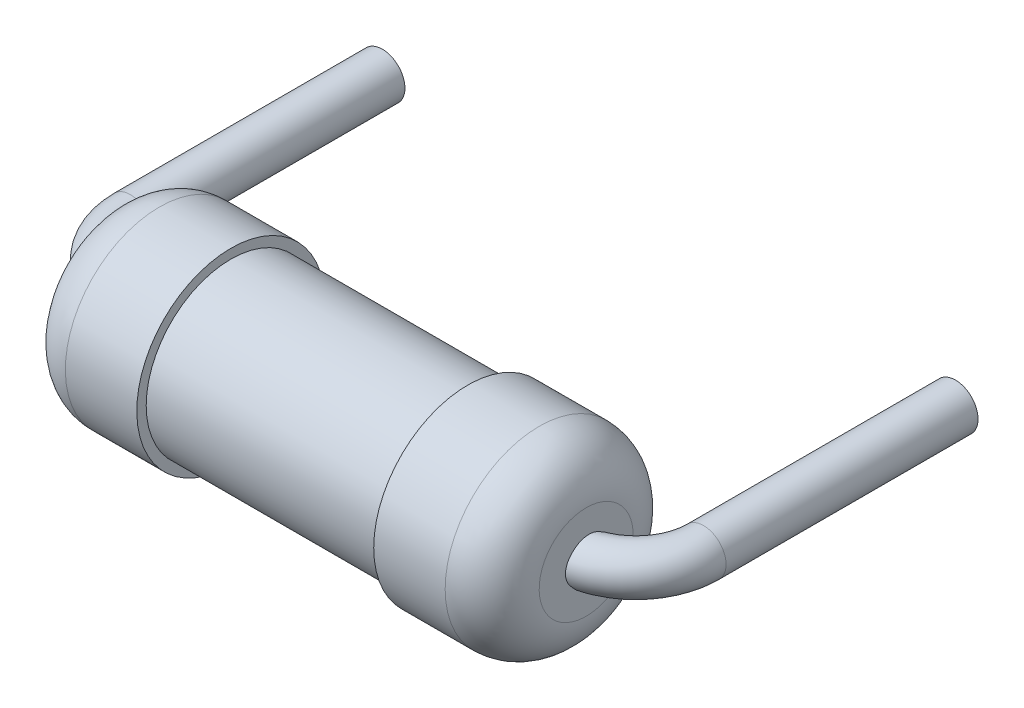
ISO-10303-21;
HEADER;
FILE_DESCRIPTION(('STEP AP214'),'2;1');
FILE_NAME('part.step','',(''),(''),'','','');
FILE_SCHEMA(('AUTOMOTIVE_DESIGN { 1 0 10303 214 1 1 1 1 }'));
ENDSEC;
DATA;
#1=APPLICATION_CONTEXT('core data for automotive mechanical design processes');
#2=APPLICATION_PROTOCOL_DEFINITION('international standard','automotive_design',2000,#1);
#3=PRODUCT_CONTEXT('',#1,'mechanical');
#4=PRODUCT('Part','Part','',(#3));
#5=PRODUCT_RELATED_PRODUCT_CATEGORY('part','',(#4));
#6=PRODUCT_DEFINITION_FORMATION('','',#4);
#7=PRODUCT_DEFINITION_CONTEXT('part definition',#1,'design');
#8=PRODUCT_DEFINITION('design','',#6,#7);
#9=PRODUCT_DEFINITION_SHAPE('','',#8);
#10=(LENGTH_UNIT() NAMED_UNIT(*) SI_UNIT(.MILLI.,.METRE.));
#11=(NAMED_UNIT(*) PLANE_ANGLE_UNIT() SI_UNIT($,.RADIAN.));
#12=(NAMED_UNIT(*) SI_UNIT($,.STERADIAN.) SOLID_ANGLE_UNIT());
#13=UNCERTAINTY_MEASURE_WITH_UNIT(LENGTH_MEASURE(1.E-05),#10,'distance_accuracy_value','');
#14=(GEOMETRIC_REPRESENTATION_CONTEXT(3) GLOBAL_UNCERTAINTY_ASSIGNED_CONTEXT((#13)) GLOBAL_UNIT_ASSIGNED_CONTEXT((#10,
#11,#12)) REPRESENTATION_CONTEXT('',''));
#15=CARTESIAN_POINT('',(0.,0.,0.));
#16=DIRECTION('',(0.,0.,1.));
#17=DIRECTION('',(1.,0.,0.));
#18=AXIS2_PLACEMENT_3D('',#15,#16,#17);
#19=CARTESIAN_POINT('',(0.66,0.,1.25));
#20=DIRECTION('',(-1.,0.,0.));
#21=DIRECTION('',(0.,1.,0.));
#22=AXIS2_PLACEMENT_3D('',#19,#20,#21);
#23=CYLINDRICAL_SURFACE('',#22,1.25);
#24=CARTESIAN_POINT('',(1.285,0.,1.25));
#25=DIRECTION('',(1.,0.,0.));
#26=DIRECTION('',(0.,1.,0.));
#27=AXIS2_PLACEMENT_3D('',#24,#25,#26);
#28=CIRCLE('',#27,1.25);
#29=CARTESIAN_POINT('',(1.285,1.25,1.25));
#30=VERTEX_POINT('',#29);
#31=EDGE_CURVE('E11',#30,#30,#28,.T.);
#32=ORIENTED_EDGE('',*,*,#31,.T.);
#33=EDGE_LOOP('',(#32));
#34=FACE_BOUND('',#33,.T.);
#35=CARTESIAN_POINT('',(2.235,0.,1.25));
#36=DIRECTION('',(1.,0.,0.));
#37=DIRECTION('',(0.,1.,0.));
#38=AXIS2_PLACEMENT_3D('',#35,#36,#37);
#39=CIRCLE('',#38,1.25);
#40=CARTESIAN_POINT('',(2.235,1.25,1.25));
#41=VERTEX_POINT('',#40);
#42=EDGE_CURVE('E30',#41,#41,#39,.T.);
#43=ORIENTED_EDGE('',*,*,#42,.F.);
#44=EDGE_LOOP('',(#43));
#45=FACE_BOUND('',#44,.T.);
#46=ADVANCED_FACE('F17',(#34,#45),#23,.T.);
#47=CARTESIAN_POINT('',(1.285,0.,1.25));
#48=DIRECTION('',(-1.,0.,0.));
#49=DIRECTION('',(0.,1.,0.));
#50=AXIS2_PLACEMENT_3D('',#47,#48,#49);
#51=DEGENERATE_TOROIDAL_SURFACE('',#50,0.625,0.625,.T.);
#52=ORIENTED_EDGE('',*,*,#31,.F.);
#53=EDGE_LOOP('',(#52));
#54=FACE_BOUND('',#53,.T.);
#55=CARTESIAN_POINT('',(0.66,0.,1.25));
#56=DIRECTION('',(1.,0.,0.));
#57=DIRECTION('',(0.,1.,0.));
#58=AXIS2_PLACEMENT_3D('',#55,#56,#57);
#59=CIRCLE('',#58,0.625);
#60=CARTESIAN_POINT('',(0.66,0.625,1.25));
#61=VERTEX_POINT('',#60);
#62=EDGE_CURVE('E108',#61,#61,#59,.T.);
#63=ORIENTED_EDGE('',*,*,#62,.T.);
#64=EDGE_LOOP('',(#63));
#65=FACE_BOUND('',#64,.T.);
#66=ADVANCED_FACE('F19',(#54,#65),#51,.T.);
#67=CARTESIAN_POINT('',(2.235,1.25,1.25));
#68=DIRECTION('',(-1.,0.,0.));
#69=DIRECTION('',(0.,0.,1.));
#70=AXIS2_PLACEMENT_3D('',#67,#68,#69);
#71=PLANE('',#70);
#72=ORIENTED_EDGE('',*,*,#42,.T.);
#73=EDGE_LOOP('',(#72));
#74=FACE_BOUND('',#73,.T.);
#75=CARTESIAN_POINT('',(2.235,0.,1.25));
#76=DIRECTION('',(-1.,0.,0.));
#77=DIRECTION('',(0.,1.,0.));
#78=AXIS2_PLACEMENT_3D('',#75,#76,#77);
#79=CIRCLE('',#78,1.125);
#80=CARTESIAN_POINT('',(2.235,1.125,1.25));
#81=VERTEX_POINT('',#80);
#82=EDGE_CURVE('E85',#81,#81,#79,.T.);
#83=ORIENTED_EDGE('',*,*,#82,.T.);
#84=EDGE_LOOP('',(#83));
#85=FACE_BOUND('',#84,.T.);
#86=ADVANCED_FACE('F155',(#74,#85),#71,.F.);
#87=CARTESIAN_POINT('',(0.66,1.25,1.25));
#88=DIRECTION('',(-1.,0.,0.));
#89=DIRECTION('',(0.,0.,1.));
#90=AXIS2_PLACEMENT_3D('',#87,#88,#89);
#91=PLANE('',#90);
#92=ORIENTED_EDGE('',*,*,#62,.F.);
#93=EDGE_LOOP('',(#92));
#94=FACE_BOUND('',#93,.T.);
#95=CARTESIAN_POINT('',(0.66,0.,0.899909083395));
#96=CARTESIAN_POINT('',(0.66,-0.009861963323296,0.899909084471));
#97=CARTESIAN_POINT('',(0.66,-0.01960383099012,0.900333558971));
#98=CARTESIAN_POINT('',(0.66,-0.0290667633729,0.901163095205));
#99=CARTESIAN_POINT('',(0.66,-0.03818473840012,0.902336888075));
#100=CARTESIAN_POINT('',(0.66,-0.04697555886318,0.903805406252));
#101=CARTESIAN_POINT('',(0.66,-0.06541217845247,0.907588617289));
#102=CARTESIAN_POINT('',(0.66,-0.07491989955217,0.909985996381));
#103=CARTESIAN_POINT('',(0.66,-0.08408858685729,0.912709602459));
#104=CARTESIAN_POINT('',(0.66,-0.0929431150905,0.915726339128));
#105=CARTESIAN_POINT('',(0.66,-0.101504886237,0.919011492948));
#106=CARTESIAN_POINT('',(0.66,-0.118958160976,0.926453793498));
#107=CARTESIAN_POINT('',(0.66,-0.127787740677,0.930666021227));
#108=CARTESIAN_POINT('',(0.66,-0.136306213845,0.935155972835));
#109=CARTESIAN_POINT('',(0.66,-0.144532125259,0.939904061777));
#110=CARTESIAN_POINT('',(0.66,-0.152479834979,0.944895594586));
#111=CARTESIAN_POINT('',(0.66,-0.168328675181,0.955672717204));
#112=CARTESIAN_POINT('',(0.66,-0.176194628708,0.961488338811));
#113=CARTESIAN_POINT('',(0.66,-0.183772627725,0.967551590964));
#114=CARTESIAN_POINT('',(0.66,-0.191071921446,0.973851630909));
#115=CARTESIAN_POINT('',(0.66,-0.19809849539,0.980379998969));
#116=CARTESIAN_POINT('',(0.66,-0.211800252103,0.99406561399));
#117=CARTESIAN_POINT('',(0.66,-0.218460183619,1.001235038361));
#118=CARTESIAN_POINT('',(0.66,-0.224839916669,1.008630424477));
#119=CARTESIAN_POINT('',(0.66,-0.230940302033,1.016245317007));
#120=CARTESIAN_POINT('',(0.66,-0.236759778797,1.024074009311));
#121=CARTESIAN_POINT('',(0.66,-0.247832030244,1.040150827903));
#122=CARTESIAN_POINT('',(0.66,-0.253084597548,1.048398894868));
#123=CARTESIAN_POINT('',(0.66,-0.258049056373,1.056850063306));
#124=CARTESIAN_POINT('',(0.66,-0.262719990238,1.065498702059));
#125=CARTESIAN_POINT('',(0.66,-0.267090249501,1.07433884651));
#126=CARTESIAN_POINT('',(0.66,-0.275134936213,1.092219038761));
#127=CARTESIAN_POINT('',(0.66,-0.278821023102,1.101251941956));
#128=CARTESIAN_POINT('',(0.66,-0.282200792082,1.110456832947));
#129=CARTESIAN_POINT('',(0.66,-0.285264705632,1.119826546568));
#130=CARTESIAN_POINT('',(0.66,-0.288002108658,1.129352827713));
#131=CARTESIAN_POINT('',(0.66,-0.29272539517,1.148397615962));
#132=CARTESIAN_POINT('',(0.66,-0.29473218058,1.157906910826));
#133=CARTESIAN_POINT('',(0.66,-0.296410836061,1.167545600214));
#134=CARTESIAN_POINT('',(0.66,-0.297750151594,1.177303530334));
#135=CARTESIAN_POINT('',(0.66,-0.298738455802,1.187169009313));
#136=CARTESIAN_POINT('',(0.66,-0.299964918417,1.206708514181));
#137=CARTESIAN_POINT('',(0.66,-0.300230384291,1.216375379318));
#138=CARTESIAN_POINT('',(0.66,-0.300149186912,1.226117491764));
#139=CARTESIAN_POINT('',(0.66,-0.299710710819,1.235921272022));
#140=CARTESIAN_POINT('',(0.66,-0.298904551758,1.245771471938));
#141=CARTESIAN_POINT('',(0.66,-0.296585103724,1.265125169703));
#142=CARTESIAN_POINT('',(0.66,-0.295102339165,1.274626258325));
#143=CARTESIAN_POINT('',(0.66,-0.293263240337,1.284139377081));
#144=CARTESIAN_POINT('',(0.66,-0.291059628806,1.293647957516));
#145=CARTESIAN_POINT('',(0.66,-0.288484130363,1.303133926208));
#146=CARTESIAN_POINT('',(0.66,-0.282698083788,1.321631884472));
#147=CARTESIAN_POINT('',(0.66,-0.279518227914,1.330647303479));
#148=CARTESIAN_POINT('',(0.66,-0.275984860345,1.33960658093));
#149=CARTESIAN_POINT('',(0.66,-0.272093455342,1.348491200819));
#150=CARTESIAN_POINT('',(0.66,-0.267840708483,1.357281511993));
#151=CARTESIAN_POINT('',(0.66,-0.258792476906,1.374285940745));
#152=CARTESIAN_POINT('',(0.66,-0.254025481533,1.382509111114));
#153=CARTESIAN_POINT('',(0.66,-0.248921768643,1.390607755283));
#154=CARTESIAN_POINT('',(0.66,-0.243480982245,1.398562700734));
#155=CARTESIAN_POINT('',(0.66,-0.237704192262,1.406354086406));
#156=CARTESIAN_POINT('',(0.66,-0.22571513259,1.421280378602));
#157=CARTESIAN_POINT('',(0.66,-0.219527706492,1.428429037341));
#158=CARTESIAN_POINT('',(0.66,-0.213033892817,1.435388992124));
#159=CARTESIAN_POINT('',(0.66,-0.206237433156,1.442141613477));
#160=CARTESIAN_POINT('',(0.66,-0.199143534101,1.448667989237));
#161=CARTESIAN_POINT('',(0.66,-0.184639374507,1.46100431938));
#162=CARTESIAN_POINT('',(0.66,-0.177249666015,1.466831638372));
#163=CARTESIAN_POINT('',(0.66,-0.169595736209,1.472413656662));
#164=CARTESIAN_POINT('',(0.66,-0.161685054894,1.477733175901));
#165=CARTESIAN_POINT('',(0.66,-0.153526567249,1.482773024258));
#166=CARTESIAN_POINT('',(0.66,-0.137020407721,1.492097753386));
#167=CARTESIAN_POINT('',(0.66,-0.128688747003,1.496402530856));
#168=CARTESIAN_POINT('',(0.66,-0.12014499879,1.500414878928));
#169=CARTESIAN_POINT('',(0.66,-0.111400259626,1.504119593216));
#170=CARTESIAN_POINT('',(0.66,-0.102467435485,1.507501774849));
#171=CARTESIAN_POINT('',(0.66,-0.08453493192811,1.513498294635));
#172=CARTESIAN_POINT('',(0.66,-0.07554639694304,1.516132890753));
#173=CARTESIAN_POINT('',(0.66,-0.0664085144705,1.518437847791));
#174=CARTESIAN_POINT('',(0.66,-0.05713783351899,1.520400106432));
#175=CARTESIAN_POINT('',(0.66,-0.04775488525608,1.522007764907));
#176=CARTESIAN_POINT('',(0.66,-0.02969295309097,1.524379864025));
#177=CARTESIAN_POINT('',(0.66,-0.02102888075484,1.525208782901));
#178=CARTESIAN_POINT('',(0.66,-0.01231401679426,1.525730893697));
#179=CARTESIAN_POINT('',(0.66,-0.003572675622322,1.525941364018));
#180=CARTESIAN_POINT('',(0.66,0.005168222805428,1.525838983228));
#181=CARTESIAN_POINT('',(0.66,0.02337847467049,1.524978205181));
#182=CARTESIAN_POINT('',(0.66,0.03284375814827,1.524161190409));
#183=CARTESIAN_POINT('',(0.66,0.04224166817951,1.522980309203));
#184=CARTESIAN_POINT('',(0.66,0.05154498116248,1.52144453626));
#185=CARTESIAN_POINT('',(0.66,0.06073223707979,1.519565307122));
#186=CARTESIAN_POINT('',(0.66,0.07909772773064,1.515080653378));
#187=CARTESIAN_POINT('',(0.66,0.08826753248322,1.512456350085));
#188=CARTESIAN_POINT('',(0.66,0.09727917108862,1.509494369221));
#189=CARTESIAN_POINT('',(0.66,0.106117308319,1.506208374239));
#190=CARTESIAN_POINT('',(0.66,0.114768939441,1.502612541932));
#191=CARTESIAN_POINT('',(0.66,0.131966117695,1.494697909774));
#192=CARTESIAN_POINT('',(0.66,0.140497702999,1.490358571609));
#193=CARTESIAN_POINT('',(0.66,0.148806061897,1.485719660214));
#194=CARTESIAN_POINT('',(0.66,0.156880650792,1.480797427009));
#195=CARTESIAN_POINT('',(0.66,0.164712466725,1.47560826256));
#196=CARTESIAN_POINT('',(0.66,0.180151423764,1.464531255078));
#197=CARTESIAN_POINT('',(0.66,0.187739958872,1.458624810593));
#198=CARTESIAN_POINT('',(0.66,0.195051326582,1.452467732556));
#199=CARTESIAN_POINT('',(0.66,0.202078661493,1.446078253645));
#200=CARTESIAN_POINT('',(0.66,0.208816558921,1.439474469779));
#201=CARTESIAN_POINT('',(0.66,0.221953232148,1.425612904145));
#202=CARTESIAN_POINT('',(0.66,0.228328983313,1.41833967682));
#203=CARTESIAN_POINT('',(0.66,0.234383958936,1.410874731309));
#204=CARTESIAN_POINT('',(0.66,0.240115246881,1.403237638329));
#205=CARTESIAN_POINT('',(0.66,0.245521392347,1.395447466144));
#206=CARTESIAN_POINT('',(0.66,0.255889855564,1.379276097975));
#207=CARTESIAN_POINT('',(0.66,0.260825146013,1.370883681886));
#208=CARTESIAN_POINT('',(0.66,0.265408341569,1.362366377835));
#209=CARTESIAN_POINT('',(0.66,0.269640849736,1.353744088225));
#210=CARTESIAN_POINT('',(0.66,0.273525413156,1.345035772328));
#211=CARTESIAN_POINT('',(0.66,0.280757352367,1.327109961101));
#212=CARTESIAN_POINT('',(0.66,0.284074759274,1.317886517643));
#213=CARTESIAN_POINT('',(0.66,0.287023012024,1.308609403309));
#214=CARTESIAN_POINT('',(0.66,0.289607802772,1.299297542852));
#215=CARTESIAN_POINT('',(0.66,0.291835834134,1.289968498384));
#216=CARTESIAN_POINT('',(0.66,0.295674958709,1.270905470981));
#217=CARTESIAN_POINT('',(0.66,0.297255116553,1.261171411794));
#218=CARTESIAN_POINT('',(0.66,0.298464074992,1.251454521799));
#219=CARTESIAN_POINT('',(0.66,0.299311100714,1.241771401083));
#220=CARTESIAN_POINT('',(0.66,0.299805944827,1.232137019844));
#221=CARTESIAN_POINT('',(0.66,0.30011808361,1.212595326012));
#222=CARTESIAN_POINT('',(0.66,0.299906283631,1.202693348802));
#223=CARTESIAN_POINT('',(0.66,0.299334987113,1.192873693594));
#224=CARTESIAN_POINT('',(0.66,0.298415571185,1.183149633751));
#225=CARTESIAN_POINT('',(0.66,0.297159245916,1.173532809156));
#226=CARTESIAN_POINT('',(0.66,0.293937772017,1.154190866917));
#227=CARTESIAN_POINT('',(0.66,0.291948568133,1.144474505513));
#228=CARTESIAN_POINT('',(0.66,0.289621677512,1.134895129825));
#229=CARTESIAN_POINT('',(0.66,0.286968496105,1.125462405282));
#230=CARTESIAN_POINT('',(0.66,0.283999580964,1.116184674916));
#231=CARTESIAN_POINT('',(0.66,0.277365684897,1.097719334783));
#232=CARTESIAN_POINT('',(0.66,0.273684712853,1.08854034335));
#233=CARTESIAN_POINT('',(0.66,0.269692176119,1.079539433524));
#234=CARTESIAN_POINT('',(0.66,0.265397048483,1.07072335418));
#235=CARTESIAN_POINT('',(0.66,0.260806835513,1.062098154612));
#236=CARTESIAN_POINT('',(0.66,0.251004164416,1.045163946312));
#237=CARTESIAN_POINT('',(0.66,0.245786379559,1.036858764173));
#238=CARTESIAN_POINT('',(0.66,0.240280407048,1.028758964174));
#239=CARTESIAN_POINT('',(0.66,0.234490342534,1.020870115558));
#240=CARTESIAN_POINT('',(0.66,0.228418190257,1.013198030747));
#241=CARTESIAN_POINT('',(0.66,0.215801462132,0.998407266407));
#242=CARTESIAN_POINT('',(0.66,0.209265037039,0.991282398269));
#243=CARTESIAN_POINT('',(0.66,0.202454011648,0.98438004474));
#244=CARTESIAN_POINT('',(0.66,0.195365844133,0.977707070031));
#245=CARTESIAN_POINT('',(0.66,0.187995125017,0.971271927442));
#246=CARTESIAN_POINT('',(0.66,0.173012685338,0.959175110633));
#247=CARTESIAN_POINT('',(0.66,0.165426730288,0.953491920673));
#248=CARTESIAN_POINT('',(0.66,0.157566473117,0.948044968651));
#249=CARTESIAN_POINT('',(0.66,0.149421191466,0.9428457983));
#250=CARTESIAN_POINT('',(0.66,0.140976348171,0.937909629891));
#251=CARTESIAN_POINT('',(0.66,0.124148062588,0.928975570166));
#252=CARTESIAN_POINT('',(0.66,0.115814079383,0.924934455913));
#253=CARTESIAN_POINT('',(0.66,0.107194119667,0.921149233675));
#254=CARTESIAN_POINT('',(0.66,0.09826941158436,0.91763978502));
#255=CARTESIAN_POINT('',(0.66,0.08901687105598,0.914432779149));
#256=CARTESIAN_POINT('',(0.66,0.06762842160337,0.908048369916));
#257=CARTESIAN_POINT('',(0.66,0.05540310162877,0.905067930004));
#258=CARTESIAN_POINT('',(0.66,0.04253150709481,0.902628405907));
#259=CARTESIAN_POINT('',(0.66,0.02893757304003,0.900850137762));
#260=CARTESIAN_POINT('',(0.66,0.01468319780375,0.899909084997));
#261=CARTESIAN_POINT('',(0.66,0.,0.899909083395));
#262=(BOUNDED_CURVE() B_SPLINE_CURVE(6,(#95,#96,#97,#98,#99,#100,#101,#102,#103,#104,#105,#106,
#107,#108,#109,#110,#111,#112,#113,#114,#115,#116,#117,#118,#119,#120,#121,#122,#123,#124,#125,
#126,#127,#128,#129,#130,#131,#132,#133,#134,#135,#136,#137,#138,#139,#140,#141,#142,#143,#144,
#145,#146,#147,#148,#149,#150,#151,#152,#153,#154,#155,#156,#157,#158,#159,#160,#161,#162,#163,
#164,#165,#166,#167,#168,#169,#170,#171,#172,#173,#174,#175,#176,#177,#178,#179,#180,#181,#182,
#183,#184,#185,#186,#187,#188,#189,#190,#191,#192,#193,#194,#195,#196,#197,#198,#199,#200,#201,
#202,#203,#204,#205,#206,#207,#208,#209,#210,#211,#212,#213,#214,#215,#216,#217,#218,#219,#220,
#221,#222,#223,#224,#225,#226,#227,#228,#229,#230,#231,#232,#233,#234,#235,#236,#237,#238,#239,
#240,#241,#242,#243,#244,#245,#246,#247,#248,#249,#250,#251,#252,#253,#254,#255,#256,#257,#258,
#259,#260,#261),.UNSPECIFIED.,.T.,.F.) B_SPLINE_CURVE_WITH_KNOTS((7,5,5,5,5,5,5,5,5,5,5,5,5,5,5,
5,5,5,5,5,5,5,5,5,5,5,5,5,5,5,5,5,5,7),(0.,0.02521870323933,0.05431496394384,0.08648919549843,
0.120700162351,0.155854554579,0.191019956077,0.22552099352,0.258944151729,0.291091798271,
0.321919308947,0.351475044446,0.379851974729,0.407153625953,0.43347490921,0.458900868731,
0.483545347382,0.505902822615,0.530283950565,0.555351989471,0.581274789002,0.608140584187,
0.636038742308,0.665070462617,0.695336577837,0.72690990423,0.759792997252,0.79386262098,
0.828806470397,0.864066503475,0.898816439436,0.932013287381,0.962558356523,1.),
.UNSPECIFIED.) CURVE() GEOMETRIC_REPRESENTATION_ITEM() RATIONAL_B_SPLINE_CURVE((1.,1.,1.,1.,1.,
1.,1.,1.,1.,1.,1.,1.,1.,1.,1.,1.,1.,1.,1.,1.,1.,1.,1.,1.,1.,1.,1.,1.,1.,1.,1.,1.,1.,1.,1.,1.,1.,
1.,1.,1.,1.,1.,1.,1.,1.,1.,1.,1.,1.,1.,1.,1.,1.,1.,1.,1.,1.,1.,1.,1.,1.,1.,1.,1.,1.,1.,1.,1.,1.,
1.,1.,1.,1.,1.,1.,1.,1.,1.,1.,1.,1.,1.,1.,1.,1.,1.,1.,1.,1.,1.,1.,1.,1.,1.,1.,1.,1.,1.,1.,1.,1.,
1.,1.,1.,1.,1.,1.,1.,1.,1.,1.,1.,1.,1.,1.,1.,1.,1.,1.,1.,1.,1.,1.,1.,1.,1.,1.,1.,1.,1.,1.,1.,1.,
1.,1.,1.,1.,1.,1.,1.,1.,1.,1.,1.,1.,1.,1.,1.,1.,1.,1.,1.,1.,1.,1.,1.,1.,1.,1.,1.,1.,1.,1.,1.,1.,
1.,1.)) REPRESENTATION_ITEM(''));
#263=CARTESIAN_POINT('',(0.66,0.,0.899909083395));
#264=VERTEX_POINT('',#263);
#265=EDGE_CURVE('E77',#264,#264,#262,.T.);
#266=ORIENTED_EDGE('',*,*,#265,.F.);
#267=EDGE_LOOP('',(#266));
#268=FACE_BOUND('',#267,.T.);
#269=ADVANCED_FACE('F152',(#94,#268),#91,.T.);
#270=CARTESIAN_POINT('',(0.66,0.,1.25));
#271=DIRECTION('',(-1.,0.,0.));
#272=DIRECTION('',(0.,1.,0.));
#273=AXIS2_PLACEMENT_3D('',#270,#271,#272);
#274=CYLINDRICAL_SURFACE('',#273,1.125);
#275=ORIENTED_EDGE('',*,*,#82,.F.);
#276=EDGE_LOOP('',(#275));
#277=FACE_BOUND('',#276,.T.);
#278=CARTESIAN_POINT('',(5.385,0.,1.25));
#279=DIRECTION('',(-1.,0.,0.));
#280=DIRECTION('',(0.,1.,0.));
#281=AXIS2_PLACEMENT_3D('',#278,#279,#280);
#282=CIRCLE('',#281,1.125);
#283=CARTESIAN_POINT('',(5.385,1.125,1.25));
#284=VERTEX_POINT('',#283);
#285=EDGE_CURVE('E73',#284,#284,#282,.T.);
#286=ORIENTED_EDGE('',*,*,#285,.T.);
#287=EDGE_LOOP('',(#286));
#288=FACE_BOUND('',#287,.T.);
#289=ADVANCED_FACE('F74',(#277,#288),#274,.T.);
#290=CARTESIAN_POINT('',(0.9,0.,0.35));
#291=DIRECTION('',(0.,1.,0.));
#292=DIRECTION('',(-1.,0.,0.));
#293=AXIS2_PLACEMENT_3D('',#290,#291,#292);
#294=TOROIDAL_SURFACE('',#293,0.9,0.3);
#295=CARTESIAN_POINT('',(0.,0.,0.35));
#296=DIRECTION('',(0.,0.,1.));
#297=DIRECTION('',(1.,0.,0.));
#298=AXIS2_PLACEMENT_3D('',#295,#296,#297);
#299=CIRCLE('',#298,0.3);
#300=CARTESIAN_POINT('',(0.3,0.,0.35));
#301=VERTEX_POINT('',#300);
#302=EDGE_CURVE('E78',#301,#301,#299,.T.);
#303=ORIENTED_EDGE('',*,*,#302,.T.);
#304=EDGE_LOOP('',(#303));
#305=FACE_BOUND('',#304,.T.);
#306=ORIENTED_EDGE('',*,*,#265,.T.);
#307=EDGE_LOOP('',(#306));
#308=FACE_BOUND('',#307,.T.);
#309=ADVANCED_FACE('F150',(#305,#308),#294,.T.);
#310=CARTESIAN_POINT('',(5.385,1.25,1.25));
#311=DIRECTION('',(-1.,0.,0.));
#312=DIRECTION('',(0.,0.,1.));
#313=AXIS2_PLACEMENT_3D('',#310,#311,#312);
#314=PLANE('',#313);
#315=CARTESIAN_POINT('',(5.385,0.,1.25));
#316=DIRECTION('',(1.,0.,0.));
#317=DIRECTION('',(0.,0.,1.));
#318=AXIS2_PLACEMENT_3D('',#315,#316,#317);
#319=CIRCLE('',#318,1.25);
#320=CARTESIAN_POINT('',(5.385,0.,2.5));
#321=VERTEX_POINT('',#320);
#322=EDGE_CURVE('E87',#321,#321,#319,.T.);
#323=ORIENTED_EDGE('',*,*,#322,.F.);
#324=EDGE_LOOP('',(#323));
#325=FACE_BOUND('',#324,.T.);
#326=ORIENTED_EDGE('',*,*,#285,.F.);
#327=EDGE_LOOP('',(#326));
#328=FACE_BOUND('',#327,.T.);
#329=ADVANCED_FACE('F146',(#325,#328),#314,.T.);
#330=CARTESIAN_POINT('',(0.,0.,-3.));
#331=DIRECTION('',(0.,0.,1.));
#332=DIRECTION('',(1.,0.,0.));
#333=AXIS2_PLACEMENT_3D('',#330,#331,#332);
#334=CYLINDRICAL_SURFACE('',#333,0.3);
#335=CARTESIAN_POINT('',(0.,0.,-3.));
#336=DIRECTION('',(0.,0.,1.));
#337=DIRECTION('',(1.,0.,0.));
#338=AXIS2_PLACEMENT_3D('',#335,#336,#337);
#339=CIRCLE('',#338,0.3);
#340=CARTESIAN_POINT('',(0.3,0.,-3.));
#341=VERTEX_POINT('',#340);
#342=EDGE_CURVE('E100',#341,#341,#339,.T.);
#343=ORIENTED_EDGE('',*,*,#342,.T.);
#344=EDGE_LOOP('',(#343));
#345=FACE_BOUND('',#344,.T.);
#346=ORIENTED_EDGE('',*,*,#302,.F.);
#347=EDGE_LOOP('',(#346));
#348=FACE_BOUND('',#347,.T.);
#349=ADVANCED_FACE('F142',(#345,#348),#334,.T.);
#350=CARTESIAN_POINT('',(0.66,0.,1.25));
#351=DIRECTION('',(-1.,0.,0.));
#352=DIRECTION('',(0.,1.,0.));
#353=AXIS2_PLACEMENT_3D('',#350,#351,#352);
#354=CYLINDRICAL_SURFACE('',#353,1.25);
#355=ORIENTED_EDGE('',*,*,#322,.T.);
#356=EDGE_LOOP('',(#355));
#357=FACE_BOUND('',#356,.T.);
#358=CARTESIAN_POINT('',(6.335,0.,1.25));
#359=DIRECTION('',(1.,0.,0.));
#360=DIRECTION('',(0.,0.,1.));
#361=AXIS2_PLACEMENT_3D('',#358,#359,#360);
#362=CIRCLE('',#361,1.25);
#363=CARTESIAN_POINT('',(6.335,0.,2.5));
#364=VERTEX_POINT('',#363);
#365=EDGE_CURVE('E96',#364,#364,#362,.T.);
#366=ORIENTED_EDGE('',*,*,#365,.F.);
#367=EDGE_LOOP('',(#366));
#368=FACE_BOUND('',#367,.T.);
#369=ADVANCED_FACE('F138',(#357,#368),#354,.T.);
#370=CARTESIAN_POINT('',(0.3,0.,-3.));
#371=DIRECTION('',(0.,0.,-1.));
#372=DIRECTION('',(0.,-1.,0.));
#373=AXIS2_PLACEMENT_3D('',#370,#371,#372);
#374=PLANE('',#373);
#375=ORIENTED_EDGE('',*,*,#342,.F.);
#376=EDGE_LOOP('',(#375));
#377=FACE_BOUND('',#376,.T.);
#378=ADVANCED_FACE('F135',(#377),#374,.T.);
#379=CARTESIAN_POINT('',(6.335,0.,1.25));
#380=DIRECTION('',(1.,0.,0.));
#381=DIRECTION('',(0.,1.,0.));
#382=AXIS2_PLACEMENT_3D('',#379,#380,#381);
#383=DEGENERATE_TOROIDAL_SURFACE('',#382,0.625,0.625,.T.);
#384=ORIENTED_EDGE('',*,*,#365,.T.);
#385=EDGE_LOOP('',(#384));
#386=FACE_BOUND('',#385,.T.);
#387=CARTESIAN_POINT('',(6.96,0.,1.25));
#388=DIRECTION('',(1.,0.,0.));
#389=DIRECTION('',(0.,1.,0.));
#390=AXIS2_PLACEMENT_3D('',#387,#388,#389);
#391=CIRCLE('',#390,0.625);
#392=CARTESIAN_POINT('',(6.96,0.625,1.25));
#393=VERTEX_POINT('',#392);
#394=EDGE_CURVE('E92',#393,#393,#391,.T.);
#395=ORIENTED_EDGE('',*,*,#394,.F.);
#396=EDGE_LOOP('',(#395));
#397=FACE_BOUND('',#396,.T.);
#398=ADVANCED_FACE('F129',(#386,#397),#383,.T.);
#399=CARTESIAN_POINT('',(6.96,1.25,1.25));
#400=DIRECTION('',(-1.,0.,0.));
#401=DIRECTION('',(0.,0.,1.));
#402=AXIS2_PLACEMENT_3D('',#399,#400,#401);
#403=PLANE('',#402);
#404=ORIENTED_EDGE('',*,*,#394,.T.);
#405=EDGE_LOOP('',(#404));
#406=FACE_BOUND('',#405,.T.);
#407=CARTESIAN_POINT('',(6.96,0.,0.899909083394701));
#408=CARTESIAN_POINT('',(6.96,-0.00464515090307552,0.899908312957105));
#409=CARTESIAN_POINT('',(6.96,-0.00929060022380352,0.900035825204967));
#410=CARTESIAN_POINT('',(6.96,-0.0185351496577525,0.900549314543951));
#411=CARTESIAN_POINT('',(6.96,-0.0231343490172355,0.900933511126194));
#412=CARTESIAN_POINT('',(6.96,-0.0322864666112606,0.901960242658717));
#413=CARTESIAN_POINT('',(6.96,-0.0368394936934856,0.902601804108054));
#414=CARTESIAN_POINT('',(6.96,-0.0458992305997862,0.904142258411151));
#415=CARTESIAN_POINT('',(6.96,-0.0504059644460301,0.905041010007167));
#416=CARTESIAN_POINT('',(6.96,-0.0593732285995151,0.907095049918052));
#417=CARTESIAN_POINT('',(6.96,-0.0638336032818246,0.908251017256786));
#418=CARTESIAN_POINT('',(6.96,-0.0727083436950235,0.910818657628239));
#419=CARTESIAN_POINT('',(6.96,-0.0771222875249094,0.912231787234338));
#420=CARTESIAN_POINT('',(6.96,-0.0859044491675969,0.91531299080666));
#421=CARTESIAN_POINT('',(6.96,-0.0902719066614501,0.916983228728959));
#422=CARTESIAN_POINT('',(6.96,-0.098961445944494,0.920577963365917));
#423=CARTESIAN_POINT('',(6.96,-0.10328237594329,0.92250523966011));
#424=CARTESIAN_POINT('',(6.96,-0.111879258758262,0.926613466030761));
#425=CARTESIAN_POINT('',(6.96,-0.116153636794551,0.928797705537416));
#426=CARTESIAN_POINT('',(6.96,-0.124657840257294,0.933419383501015));
#427=CARTESIAN_POINT('',(6.96,-0.128885658035692,0.935860509152566));
#428=CARTESIAN_POINT('',(6.96,-0.137297169145723,0.940995599861028));
#429=CARTESIAN_POINT('',(6.96,-0.141478431827998,0.943693538655672));
#430=CARTESIAN_POINT('',(6.96,-0.14979724943454,0.949342003500964));
#431=CARTESIAN_POINT('',(6.96,-0.153931977122868,0.952296685175304));
#432=CARTESIAN_POINT('',(6.96,-0.162158099116802,0.958458499591553));
#433=CARTESIAN_POINT('',(6.96,-0.166246308084341,0.961669876379513));
#434=CARTESIAN_POINT('',(6.96,-0.174379773178417,0.96834498232173));
#435=CARTESIAN_POINT('',(6.96,-0.178421533957142,0.97181296219676));
#436=CARTESIAN_POINT('',(6.96,-0.186462251794997,0.979001455229789));
#437=CARTESIAN_POINT('',(6.96,-0.190457450117075,0.982726164698422));
#438=CARTESIAN_POINT('',(6.96,-0.198405850940577,0.990427570358769));
#439=CARTESIAN_POINT('',(6.96,-0.202355102294502,0.994408335464344));
#440=CARTESIAN_POINT('',(6.96,-0.21007642974719,1.00248510536824));
#441=CARTESIAN_POINT('',(6.96,-0.21384955081962,1.00658011086972));
#442=CARTESIAN_POINT('',(6.96,-0.221149565082855,1.01482759532801));
#443=CARTESIAN_POINT('',(6.96,-0.224680018560533,1.0189769162224));
#444=CARTESIAN_POINT('',(6.96,-0.231495254846035,1.02733216748696));
#445=CARTESIAN_POINT('',(6.96,-0.234783588516856,1.03153519745495));
#446=CARTESIAN_POINT('',(6.96,-0.241114443084235,1.0399977745156));
#447=CARTESIAN_POINT('',(6.96,-0.244160465481567,1.04425469779255));
#448=CARTESIAN_POINT('',(6.96,-0.250006807920047,1.05282472273027));
#449=CARTESIAN_POINT('',(6.96,-0.252810511925268,1.05713551235322));
#450=CARTESIAN_POINT('',(6.96,-0.258172344861126,1.06581295503427));
#451=CARTESIAN_POINT('',(6.96,-0.260733669129637,1.07017763067144));
#452=CARTESIAN_POINT('',(6.96,-0.265610957434044,1.07896249352609));
#453=CARTESIAN_POINT('',(6.96,-0.267929850429449,1.08338105226087));
#454=CARTESIAN_POINT('',(6.96,-0.272322566952931,1.09227332111284));
#455=CARTESIAN_POINT('',(6.96,-0.274398973083726,1.09674575372458));
#456=CARTESIAN_POINT('',(6.96,-0.278307088039448,1.10574541001055));
#457=CARTESIAN_POINT('',(6.96,-0.280140954422157,1.11027169563119));
#458=CARTESIAN_POINT('',(6.96,-0.283564440711702,1.11937871306491));
#459=CARTESIAN_POINT('',(6.96,-0.285155720204321,1.12395882037427));
#460=CARTESIAN_POINT('',(6.96,-0.288094551247836,1.13317316643955));
#461=CARTESIAN_POINT('',(6.96,-0.289443201838191,1.13780705440356));
#462=CARTESIAN_POINT('',(6.96,-0.291897364044817,1.14712869080963));
#463=CARTESIAN_POINT('',(6.96,-0.29300336610516,1.15181631007568));
#464=CARTESIAN_POINT('',(6.96,-0.294972819976002,1.16124519572927));
#465=CARTESIAN_POINT('',(6.96,-0.295836123627636,1.16598649305636));
#466=CARTESIAN_POINT('',(6.96,-0.297320953919268,1.1755225807983));
#467=CARTESIAN_POINT('',(6.96,-0.297941684212545,1.18031749511872));
#468=CARTESIAN_POINT('',(6.96,-0.298941541447439,1.18996075298736));
#469=CARTESIAN_POINT('',(6.96,-0.299319231707233,1.19480924498018));
#470=CARTESIAN_POINT('',(6.96,-0.299835431455256,1.20455958606374));
#471=CARTESIAN_POINT('',(6.96,-0.299971910848105,1.20946154189115));
#472=CARTESIAN_POINT('',(6.96,-0.299999165741492,1.21919430910048));
#473=CARTESIAN_POINT('',(6.96,-0.299893518394509,1.22402510861072));
#474=CARTESIAN_POINT('',(6.96,-0.299432660869416,1.23363835355405));
#475=CARTESIAN_POINT('',(6.96,-0.299079342873309,1.23842088850053));
#476=CARTESIAN_POINT('',(6.96,-0.298125562460233,1.24793748600798));
#477=CARTESIAN_POINT('',(6.96,-0.297526325628088,1.25267167129115));
#478=CARTESIAN_POINT('',(6.96,-0.296080907310997,1.26209155502846));
#479=CARTESIAN_POINT('',(6.96,-0.295235273023964,1.26677733735306));
#480=CARTESIAN_POINT('',(6.96,-0.293297877120227,1.27610046505663));
#481=CARTESIAN_POINT('',(6.96,-0.292205977954907,1.28073778184529));
#482=CARTESIAN_POINT('',(6.96,-0.289776706885307,1.2899641051791));
#483=CARTESIAN_POINT('',(6.96,-0.288438531494957,1.29455290003659));
#484=CARTESIAN_POINT('',(6.96,-0.285517378296093,1.30368237549924));
#485=CARTESIAN_POINT('',(6.96,-0.283932971230214,1.30822259832796));
#486=CARTESIAN_POINT('',(6.96,-0.280519965936267,1.31725518693932));
#487=CARTESIAN_POINT('',(6.96,-0.278689371169645,1.32174679739411));
#488=CARTESIAN_POINT('',(6.96,-0.274784539611307,1.33068246676236));
#489=CARTESIAN_POINT('',(6.96,-0.272707811725706,1.33512543556011));
#490=CARTESIAN_POINT('',(6.96,-0.26831118483586,1.34396416090238));
#491=CARTESIAN_POINT('',(6.96,-0.265988382048203,1.34835847083554));
#492=CARTESIAN_POINT('',(6.96,-0.261099990093797,1.3571002343528));
#493=CARTESIAN_POINT('',(6.96,-0.258531170365958,1.36144587852044));
#494=CARTESIAN_POINT('',(6.96,-0.253151046613026,1.37009067291446));
#495=CARTESIAN_POINT('',(6.96,-0.250336270631367,1.37438765880562));
#496=CARTESIAN_POINT('',(6.96,-0.244464432911715,1.38293547218842));
#497=CARTESIAN_POINT('',(6.96,-0.241403738277203,1.38718379988396));
#498=CARTESIAN_POINT('',(6.96,-0.235040253102515,1.39563467007619));
#499=CARTESIAN_POINT('',(6.96,-0.231733743588432,1.39983440754666));
#500=CARTESIAN_POINT('',(6.96,-0.224878475693069,1.40818820840224));
#501=CARTESIAN_POINT('',(6.96,-0.221325970587832,1.41233919196274));
#502=CARTESIAN_POINT('',(6.96,-0.213979545383512,1.4205964511119));
#503=CARTESIAN_POINT('',(6.96,-0.210181929024439,1.42469943175944));
#504=CARTESIAN_POINT('',(6.96,-0.202488204574045,1.43270603572653));
#505=CARTESIAN_POINT('',(6.96,-0.198594122234768,1.43661160436114));
#506=CARTESIAN_POINT('',(6.96,-0.19074794873757,1.44416755690236));
#507=CARTESIAN_POINT('',(6.96,-0.186799634277476,1.44782185312281));
#508=CARTESIAN_POINT('',(6.96,-0.17884604426242,1.45487589696122));
#509=CARTESIAN_POINT('',(6.96,-0.174844290835956,1.45827960943899));
#510=CARTESIAN_POINT('',(6.96,-0.166783856582317,1.46483223914453));
#511=CARTESIAN_POINT('',(6.96,-0.162728419430198,1.46798513872173));
#512=CARTESIAN_POINT('',(6.96,-0.154560976927642,1.47403619737847));
#513=CARTESIAN_POINT('',(6.96,-0.15045188438845,1.47693828088686));
#514=CARTESIAN_POINT('',(6.96,-0.142177466224948,1.48248777426311));
#515=CARTESIAN_POINT('',(6.96,-0.138014684096461,1.4851389696158));
#516=CARTESIAN_POINT('',(6.96,-0.129633279937717,1.49018685599517));
#517=CARTESIAN_POINT('',(6.96,-0.125416801724972,1.49258710030614));
#518=CARTESIAN_POINT('',(6.96,-0.116928422262358,1.4971333462176));
#519=CARTESIAN_POINT('',(6.96,-0.112658248918912,1.49928256861424));
#520=CARTESIAN_POINT('',(6.96,-0.104062910684424,1.50332713593461));
#521=CARTESIAN_POINT('',(6.96,-0.0997390583847672,1.50522526600895));
#522=CARTESIAN_POINT('',(6.96,-0.0910367885566632,1.50876811836332));
#523=CARTESIAN_POINT('',(6.96,-0.0866592880806897,1.51041509011899));
#524=CARTESIAN_POINT('',(6.96,-0.0778501230656467,1.51345619140808));
#525=CARTESIAN_POINT('',(6.96,-0.0734190196397179,1.51485194454287));
#526=CARTESIAN_POINT('',(6.96,-0.0645030047293544,1.5173912715485));
#527=CARTESIAN_POINT('',(6.96,-0.0600183565997333,1.51853576941398));
#528=CARTESIAN_POINT('',(6.96,-0.0509955425256802,1.52057327648782));
#529=CARTESIAN_POINT('',(6.96,-0.0464574157069776,1.52146645894337));
#530=CARTESIAN_POINT('',(6.96,-0.037327861678373,1.52300221825665));
#531=CARTESIAN_POINT('',(6.96,-0.0327363332736773,1.52364419324677));
#532=CARTESIAN_POINT('',(6.96,-0.0235000831854182,1.52467787744452));
#533=CARTESIAN_POINT('',(6.96,-0.0188552080777934,1.52506821142297));
#534=CARTESIAN_POINT('',(6.96,-0.00951236559339489,1.52560103840498));
#535=CARTESIAN_POINT('',(6.96,-0.00481427922744185,1.52574142976228));
#536=CARTESIAN_POINT('',(6.96,0.00452576661749615,1.52576851247883));
#537=CARTESIAN_POINT('',(6.96,0.00916771573682983,1.52565826020282));
#538=CARTESIAN_POINT('',(6.96,0.0184060283004402,1.52517964528139));
#539=CARTESIAN_POINT('',(6.96,0.0230024840326347,1.52481308612684));
#540=CARTESIAN_POINT('',(6.96,0.0321496869335559,1.52382428183666));
#541=CARTESIAN_POINT('',(6.96,0.0367005424590481,1.52320303959498));
#542=CARTESIAN_POINT('',(6.96,0.0457565527174649,1.52170524099815));
#543=CARTESIAN_POINT('',(6.96,0.0502617392435908,1.52082887698876));
#544=CARTESIAN_POINT('',(6.96,0.0592265028980986,1.51882177345453));
#545=CARTESIAN_POINT('',(6.96,0.0636859432144466,1.5176904232762));
#546=CARTESIAN_POINT('',(6.96,0.0725594010216463,1.51517411830697));
#547=CARTESIAN_POINT('',(6.96,0.0769730283115791,1.51378778897459));
#548=CARTESIAN_POINT('',(6.96,0.0857551288699724,1.51076228613134));
#549=CARTESIAN_POINT('',(6.96,0.0901228872340367,1.50912104041365));
#550=CARTESIAN_POINT('',(6.96,0.0988135867642312,1.50558637899229));
#551=CARTESIAN_POINT('',(6.96,0.103135435086564,1.50369028066901));
#552=CARTESIAN_POINT('',(6.96,0.111734699682506,1.49964649615196));
#553=CARTESIAN_POINT('',(6.96,0.116010612515848,1.49749561850074));
#554=CARTESIAN_POINT('',(6.96,0.124518418900676,1.49294275045415));
#555=CARTESIAN_POINT('',(6.96,0.128748386661333,1.49053716810086));
#556=CARTESIAN_POINT('',(6.96,0.137164720899552,1.48547525394919));
#557=CARTESIAN_POINT('',(6.96,0.141348746736614,1.48281503789888));
#558=CARTESIAN_POINT('',(6.96,0.149673607587996,1.47724411644712));
#559=CARTESIAN_POINT('',(6.96,0.153811710986669,1.47432933699507));
#560=CARTESIAN_POINT('',(6.96,0.162045092001444,1.46824942899116));
#561=CARTESIAN_POINT('',(6.96,0.166137282851032,1.46508012855707));
#562=CARTESIAN_POINT('',(6.96,0.174279234358899,1.45849130483057));
#563=CARTESIAN_POINT('',(6.96,0.178325599362302,1.45506759343364));
#564=CARTESIAN_POINT('',(6.96,0.18637598100274,1.44796970837811));
#565=CARTESIAN_POINT('',(6.96,0.190376335676432,1.44429138934777));
#566=CARTESIAN_POINT('',(6.96,0.198335766340441,1.43668511132672));
#567=CARTESIAN_POINT('',(6.96,0.202290991689558,1.43275313150664));
#568=CARTESIAN_POINT('',(6.96,0.210020694547891,1.42477676745918));
#569=CARTESIAN_POINT('',(6.96,0.213796375723826,1.42073355034429));
#570=CARTESIAN_POINT('',(6.96,0.221101129769062,1.4125867866378));
#571=CARTESIAN_POINT('',(6.96,0.224633775171269,1.40848645043842));
#572=CARTESIAN_POINT('',(6.96,0.231453291488561,1.40022658986248));
#573=CARTESIAN_POINT('',(6.96,0.2347437172821,1.3960700044787));
#574=CARTESIAN_POINT('',(6.96,0.241078583817032,1.38769767658124));
#575=CARTESIAN_POINT('',(6.96,0.244126527121159,1.38348458873338));
#576=CARTESIAN_POINT('',(6.96,0.249976562594115,1.37499962254986));
#577=CARTESIAN_POINT('',(6.96,0.252782032825782,1.37073007683005));
#578=CARTESIAN_POINT('',(6.96,0.258147251915788,1.3621325156189));
#579=CARTESIAN_POINT('',(6.96,0.26071018129025,1.35780648792369));
#580=CARTESIAN_POINT('',(6.96,0.265590544476053,1.34909632656529));
#581=CARTESIAN_POINT('',(6.96,0.267910881057043,1.34471382167776));
#582=CARTESIAN_POINT('',(6.96,0.272306361114151,1.33589107614515));
#583=CARTESIAN_POINT('',(6.96,0.274384047556539,1.33145210408773));
#584=CARTESIAN_POINT('',(6.96,0.27829461365405,1.3225167939009));
#585=CARTESIAN_POINT('',(6.96,0.280129596157631,1.31802137717424));
#586=CARTESIAN_POINT('',(6.96,0.283555220520124,1.30897353006978));
#587=CARTESIAN_POINT('',(6.96,0.285147451271036,1.3044217018539));
#588=CARTESIAN_POINT('',(6.96,0.288088107300467,1.295261351847));
#589=CARTESIAN_POINT('',(6.96,0.289437544905123,1.29065315525834));
#590=CARTESIAN_POINT('',(6.96,0.291893217585958,1.28138034214933));
#591=CARTESIAN_POINT('',(6.96,0.292999841332212,1.27671582859254));
#592=CARTESIAN_POINT('',(6.96,0.294970496490638,1.26733059494436));
#593=CARTESIAN_POINT('',(6.96,0.295834264799913,1.26260981962592));
#594=CARTESIAN_POINT('',(6.96,0.297319968862624,1.25311221357556));
#595=CARTESIAN_POINT('',(6.96,0.297940982891939,1.24833523879734));
#596=CARTESIAN_POINT('',(6.96,0.298941457721108,1.23872529398668));
#597=CARTESIAN_POINT('',(6.96,0.299319349707682,1.23389216119707));
#598=CARTESIAN_POINT('',(6.96,0.299835647101386,1.22416996209176));
#599=CARTESIAN_POINT('',(6.96,0.299971884813433,1.21928078157725));
#600=CARTESIAN_POINT('',(6.96,0.299999768709389,1.20954943829125));
#601=CARTESIAN_POINT('',(6.96,0.299893793710053,1.20470728327679));
#602=CARTESIAN_POINT('',(6.96,0.299432551631484,1.19506854867657));
#603=CARTESIAN_POINT('',(6.96,0.299079027472284,1.19027188668431));
#604=CARTESIAN_POINT('',(6.96,0.298124752587049,1.18072424993183));
#605=CARTESIAN_POINT('',(6.96,0.297525082898108,1.17597316721427));
#606=CARTESIAN_POINT('',(6.96,0.296078807083825,1.16651669533316));
#607=CARTESIAN_POINT('',(6.96,0.295232608448597,1.1618112439017));
#608=CARTESIAN_POINT('',(6.96,0.293294060310733,1.15244597808852));
#609=CARTESIAN_POINT('',(6.96,0.292201442874606,1.14778621918691));
#610=CARTESIAN_POINT('',(6.96,0.289770707563407,1.13851220672716));
#611=CARTESIAN_POINT('',(6.96,0.288431668196286,1.13389819486801));
#612=CARTESIAN_POINT('',(6.96,0.285508743927829,1.12471547785627));
#613=CARTESIAN_POINT('',(6.96,0.283923326441319,1.12014726105822));
#614=CARTESIAN_POINT('',(6.96,0.280508242014215,1.1110558769597));
#615=CARTESIAN_POINT('',(6.96,0.278676491179273,1.10653349345435));
#616=CARTESIAN_POINT('',(6.96,0.274769272514776,1.09753347311876));
#617=CARTESIAN_POINT('',(6.96,0.272691242465615,1.09305695023258));
#618=CARTESIAN_POINT('',(6.96,0.268291919839574,1.08414831703705));
#619=CARTESIAN_POINT('',(6.96,0.265967667915201,1.07971767038242));
#620=CARTESIAN_POINT('',(6.96,0.26107627095935,1.07090044079555));
#621=CARTESIAN_POINT('',(6.96,0.258505853949237,1.06651567593256));
#622=CARTESIAN_POINT('',(6.96,0.253122414708894,1.0577898566212));
#623=CARTESIAN_POINT('',(6.96,0.250305891308866,1.05345096579746));
#624=CARTESIAN_POINT('',(6.96,0.244430427971739,1.04481656658214));
#625=CARTESIAN_POINT('',(6.96,0.241367835955566,1.0405235475081));
#626=CARTESIAN_POINT('',(6.96,0.235000409211412,1.03198053532868));
#627=CARTESIAN_POINT('',(6.96,0.231691843913997,1.02773332737225));
#628=CARTESIAN_POINT('',(6.96,0.224832336560852,1.0192818081704));
#629=CARTESIAN_POINT('',(6.96,0.221277642295185,1.01508054737542));
#630=CARTESIAN_POINT('',(6.96,0.213926606196996,1.00672007063734));
#631=CARTESIAN_POINT('',(6.96,0.210126563908198,1.00256411477358));
#632=CARTESIAN_POINT('',(6.96,0.202406219388528,0.994427335920202));
#633=CARTESIAN_POINT('',(6.96,0.198487099900323,0.990445391472936));
#634=CARTESIAN_POINT('',(6.96,0.190593905049836,0.98274264254966));
#635=CARTESIAN_POINT('',(6.96,0.186623819920136,0.979017759169769));
#636=CARTESIAN_POINT('',(6.96,0.178629625966002,0.971828628542265));
#637=CARTESIAN_POINT('',(6.96,0.17460926766861,0.968360217927104));
#638=CARTESIAN_POINT('',(6.96,0.166514573949385,0.961684283368243));
#639=CARTESIAN_POINT('',(6.96,0.162443719578414,0.958472547106341));
#640=CARTESIAN_POINT('',(6.96,0.154248377452874,0.952309945999681));
#641=CARTESIAN_POINT('',(6.96,0.150127044155947,0.949354894293222));
#642=CARTESIAN_POINT('',(6.96,0.141831078105542,0.943705626048613));
#643=CARTESIAN_POINT('',(6.96,0.137659228385583,0.941007330584433));
#644=CARTESIAN_POINT('',(6.96,0.129262626060767,0.9358714364834));
#645=CARTESIAN_POINT('',(6.96,0.125040247666134,0.933429963667499));
#646=CARTESIAN_POINT('',(6.96,0.116543016383844,0.928807479268945));
#647=CARTESIAN_POINT('',(6.96,0.112270105326085,0.926622904695598));
#648=CARTESIAN_POINT('',(6.96,0.103672259286803,0.922513870536068));
#649=CARTESIAN_POINT('',(6.96,0.0993488274835219,0.920586271088099));
#650=CARTESIAN_POINT('',(6.96,0.0906503922784514,0.916990727213365));
#651=CARTESIAN_POINT('',(6.96,0.0862764675833064,0.91532017722631));
#652=CARTESIAN_POINT('',(6.96,0.0774774796343786,0.912238162648132));
#653=CARTESIAN_POINT('',(6.96,0.0730531066850047,0.91082472986385));
#654=CARTESIAN_POINT('',(6.96,0.0641536115874819,0.908256275841103));
#655=CARTESIAN_POINT('',(6.96,0.0596788486991997,0.907100011020825));
#656=CARTESIAN_POINT('',(6.96,0.0506789033327687,0.905045153132451));
#657=CARTESIAN_POINT('',(6.96,0.046153824738461,0.904146105228329));
#658=CARTESIAN_POINT('',(6.96,0.0370534797729308,0.902604827740952));
#659=CARTESIAN_POINT('',(6.96,0.0324781508256892,0.901962967670089));
#660=CARTESIAN_POINT('',(6.96,0.0232775027482927,0.900935402556759));
#661=CARTESIAN_POINT('',(6.96,0.0186520502790104,0.900550896086803));
#662=CARTESIAN_POINT('',(6.96,0.0093510305878735,0.900036572384465));
#663=CARTESIAN_POINT('',(6.96,0.00467535261541629,0.899908749940298));
#664=CARTESIAN_POINT('',(6.96,0.,0.899909083394701));
#665=B_SPLINE_CURVE_WITH_KNOTS('',3,(#407,#408,#409,#410,#411,#412,#413,#414,#415,#416,#417,
#418,#419,#420,#421,#422,#423,#424,#425,#426,#427,#428,#429,#430,#431,#432,#433,#434,#435,#436,
#437,#438,#439,#440,#441,#442,#443,#444,#445,#446,#447,#448,#449,#450,#451,#452,#453,#454,#455,
#456,#457,#458,#459,#460,#461,#462,#463,#464,#465,#466,#467,#468,#469,#470,#471,#472,#473,#474,
#475,#476,#477,#478,#479,#480,#481,#482,#483,#484,#485,#486,#487,#488,#489,#490,#491,#492,#493,
#494,#495,#496,#497,#498,#499,#500,#501,#502,#503,#504,#505,#506,#507,#508,#509,#510,#511,#512,
#513,#514,#515,#516,#517,#518,#519,#520,#521,#522,#523,#524,#525,#526,#527,#528,#529,#530,#531,
#532,#533,#534,#535,#536,#537,#538,#539,#540,#541,#542,#543,#544,#545,#546,#547,#548,#549,#550,
#551,#552,#553,#554,#555,#556,#557,#558,#559,#560,#561,#562,#563,#564,#565,#566,#567,#568,#569,
#570,#571,#572,#573,#574,#575,#576,#577,#578,#579,#580,#581,#582,#583,#584,#585,#586,#587,#588,
#589,#590,#591,#592,#593,#594,#595,#596,#597,#598,#599,#600,#601,#602,#603,#604,#605,#606,#607,
#608,#609,#610,#611,#612,#613,#614,#615,#616,#617,#618,#619,#620,#621,#622,#623,#624,#625,#626,
#627,#628,#629,#630,#631,#632,#633,#634,#635,#636,#637,#638,#639,#640,#641,#642,#643,#644,#645,
#646,#647,#648,#649,#650,#651,#652,#653,#654,#655,#656,#657,#658,#659,#660,#661,#662,#663,#664),
.UNSPECIFIED.,.F.,.F.,(4,2,2,2,2,2,2,2,2,2,2,2,2,2,2,2,2,2,2,2,2,2,2,2,2,2,2,2,2,2,2,2,2,2,2,2,
2,2,2,2,2,2,2,2,2,2,2,2,2,2,2,2,2,2,2,2,2,2,2,2,2,2,2,2,2,2,2,2,2,2,2,2,2,2,2,2,2,2,2,2,2,2,2,2,
2,2,2,2,2,2,2,2,2,2,2,2,2,2,2,2,2,2,2,2,2,2,2,2,2,2,2,2,2,2,2,2,2,2,2,2,2,2,2,2,2,2,2,2,4),(0.,
0.0139340992095638,0.0277725334220843,0.0415591090376262,0.0553381270733367,0.0691539612475854,
0.0830506326083392,0.0970714008099673,0.111258390345994,0.125652266415469,0.140291970291847,
0.155214518866042,0.170454868185756,0.186045836850377,0.202018082324699,0.218400121640954,
0.235218387422633,0.251919165297854,0.268258774042801,0.28426369792919,0.299962115226832,
0.315383884420519,0.33056049691628,0.345524991929485,0.360311830588396,0.374956728212474,
0.389496446149403,0.403968547286482,0.418411122102935,0.432862494553555,0.44736091882845,
0.46194427885191,0.476649802136155,0.49113947079099,0.505519629345911,0.519828975454347,
0.534106782557888,0.548392584214408,0.562725847830957,0.577145651105694,0.591690374228233,
0.606397419430759,0.621302967059594,0.636441774320749,0.651847019664914,0.667550192802405,
0.68358102786196,0.699967475386543,0.716735707729091,0.733277235569859,0.749412296783399,
0.76516797878962,0.780573370334671,0.795659586556445,0.81045975578462,0.825008960454765,
0.839344125676819,0.853503851147748,0.867528185247419,0.881458344131116,0.895336383047675,
0.909204831406186,0.923106306638495,0.937083124067902,0.951176920410057,0.965099779244341,
0.97892564372026,0.992697579663934,1.00645915920663,1.02025405261421,1.03412561552133,
1.04811649081879,1.06226824288116,1.07662103849818,1.09121338438074,1.10608192618656,
1.12126130935091,1.13678409814068,1.15268074656469,1.16897961312542,1.18570701076987,
1.2022990438371,1.21853121754749,1.23443045542365,1.25002540545047,1.2653464226247,
1.28042551635694,1.29529625836721,1.30999364819343,1.324553935522,1.33901440114709,
1.3534131012522,1.36778858256438,1.38217957838869,1.39662469722833,1.41116211637292,
1.42582929238255,1.44035303902034,1.45477554322039,1.46913537222041,1.48347159909246,
1.49782348968052,1.51223018175342,1.5267303693392,1.54136200472524,1.55616202900307,
1.57116613956273,1.58640859996963,1.60192209458989,1.61773762752171,1.63388446309433,
1.65039010354264,1.66728029847094,1.68403747996075,1.70036469984956,1.71628902705513,
1.73183963458154,1.74704784623737,1.76194714551398,1.77657313764913,1.79096345671363,
1.80515761147737,1.81919676693534,1.83312346260685,1.84698127370812,1.8608144264416,
1.87466738318067,1.88858441648949,1.90260919212624),.UNSPECIFIED.);
#666=CARTESIAN_POINT('',(6.96,0.,0.899909083395059));
#667=VERTEX_POINT('',#666);
#668=EDGE_CURVE('E97',#667,#667,#665,.T.);
#669=ORIENTED_EDGE('',*,*,#668,.T.);
#670=EDGE_LOOP('',(#669));
#671=FACE_BOUND('',#670,.T.);
#672=ADVANCED_FACE('F119',(#406,#671),#403,.F.);
#673=CARTESIAN_POINT('',(6.72,0.,0.35));
#674=DIRECTION('',(0.,1.,0.));
#675=DIRECTION('',(0.,0.,1.));
#676=AXIS2_PLACEMENT_3D('',#673,#674,#675);
#677=TOROIDAL_SURFACE('',#676,0.9,0.3);
#678=ORIENTED_EDGE('',*,*,#668,.F.);
#679=EDGE_LOOP('',(#678));
#680=FACE_BOUND('',#679,.T.);
#681=CARTESIAN_POINT('',(7.62,0.,0.35));
#682=DIRECTION('',(0.,0.,1.));
#683=DIRECTION('',(1.,0.,0.));
#684=AXIS2_PLACEMENT_3D('',#681,#682,#683);
#685=CIRCLE('',#684,0.3);
#686=CARTESIAN_POINT('',(7.92,0.,0.35));
#687=VERTEX_POINT('',#686);
#688=EDGE_CURVE('E174',#687,#687,#685,.T.);
#689=ORIENTED_EDGE('',*,*,#688,.T.);
#690=EDGE_LOOP('',(#689));
#691=FACE_BOUND('',#690,.T.);
#692=ADVANCED_FACE('F128',(#680,#691),#677,.T.);
#693=CARTESIAN_POINT('',(7.62,0.,0.35));
#694=DIRECTION('',(0.,0.,-1.));
#695=DIRECTION('',(-1.,0.,0.));
#696=AXIS2_PLACEMENT_3D('',#693,#694,#695);
#697=CYLINDRICAL_SURFACE('',#696,0.3);
#698=ORIENTED_EDGE('',*,*,#688,.F.);
#699=EDGE_LOOP('',(#698));
#700=FACE_BOUND('',#699,.T.);
#701=CARTESIAN_POINT('',(7.62,0.,-3.));
#702=DIRECTION('',(0.,0.,-1.));
#703=DIRECTION('',(-1.,0.,0.));
#704=AXIS2_PLACEMENT_3D('',#701,#702,#703);
#705=CIRCLE('',#704,0.3);
#706=CARTESIAN_POINT('',(7.32,0.,-3.));
#707=VERTEX_POINT('',#706);
#708=EDGE_CURVE('E178',#707,#707,#705,.T.);
#709=ORIENTED_EDGE('',*,*,#708,.F.);
#710=EDGE_LOOP('',(#709));
#711=FACE_BOUND('',#710,.T.);
#712=ADVANCED_FACE('F191',(#700,#711),#697,.T.);
#713=CARTESIAN_POINT('',(0.3,0.,-3.));
#714=DIRECTION('',(0.,0.,-1.));
#715=DIRECTION('',(0.,-1.,0.));
#716=AXIS2_PLACEMENT_3D('',#713,#714,#715);
#717=PLANE('',#716);
#718=ORIENTED_EDGE('',*,*,#708,.T.);
#719=EDGE_LOOP('',(#718));
#720=FACE_BOUND('',#719,.T.);
#721=ADVANCED_FACE('F186',(#720),#717,.T.);
#722=CLOSED_SHELL('',(#46,#66,#86,#269,#289,#309,#329,#349,#369,#378,#398,#672,#692,#712,#721));
#723=MANIFOLD_SOLID_BREP('B1',#722);
#724=ADVANCED_BREP_SHAPE_REPRESENTATION('',(#18,#723),#14);
#725=SHAPE_DEFINITION_REPRESENTATION(#9,#724);
ENDSEC;
END-ISO-10303-21;
